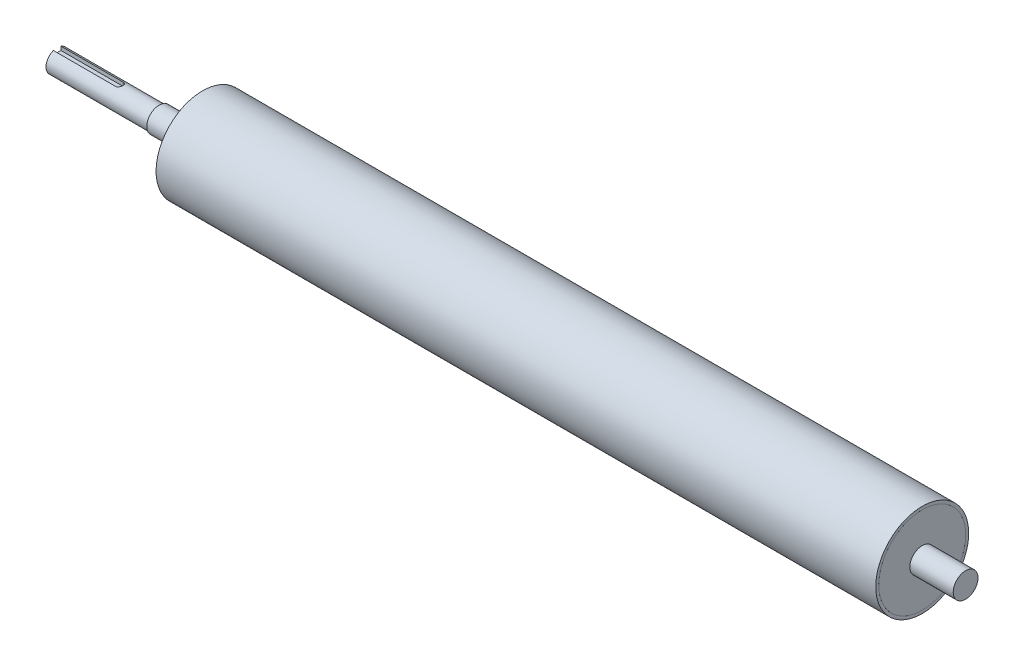
ISO-10303-21;
HEADER;
FILE_DESCRIPTION(('STEP AP214'),'2;1');
FILE_NAME('part.step','',(''),(''),'','','');
FILE_SCHEMA(('AUTOMOTIVE_DESIGN { 1 0 10303 214 1 1 1 1 }'));
ENDSEC;
DATA;
#1=APPLICATION_CONTEXT('core data for automotive mechanical design processes');
#2=APPLICATION_PROTOCOL_DEFINITION('international standard','automotive_design',2000,#1);
#3=PRODUCT_CONTEXT('',#1,'mechanical');
#4=PRODUCT('Part','Part','',(#3));
#5=PRODUCT_RELATED_PRODUCT_CATEGORY('part','',(#4));
#6=PRODUCT_DEFINITION_FORMATION('','',#4);
#7=PRODUCT_DEFINITION_CONTEXT('part definition',#1,'design');
#8=PRODUCT_DEFINITION('design','',#6,#7);
#9=PRODUCT_DEFINITION_SHAPE('','',#8);
#10=(LENGTH_UNIT() NAMED_UNIT(*) SI_UNIT(.MILLI.,.METRE.));
#11=(NAMED_UNIT(*) PLANE_ANGLE_UNIT() SI_UNIT($,.RADIAN.));
#12=(NAMED_UNIT(*) SI_UNIT($,.STERADIAN.) SOLID_ANGLE_UNIT());
#13=UNCERTAINTY_MEASURE_WITH_UNIT(LENGTH_MEASURE(1.E-05),#10,'distance_accuracy_value','');
#14=(GEOMETRIC_REPRESENTATION_CONTEXT(3) GLOBAL_UNCERTAINTY_ASSIGNED_CONTEXT((#13)) GLOBAL_UNIT_ASSIGNED_CONTEXT((#10,
#11,#12)) REPRESENTATION_CONTEXT('',''));
#15=CARTESIAN_POINT('',(0.,0.,0.));
#16=DIRECTION('',(0.,0.,1.));
#17=DIRECTION('',(1.,0.,0.));
#18=AXIS2_PLACEMENT_3D('',#15,#16,#17);
#19=CARTESIAN_POINT('',(-325.3,9.99999999999996,0.));
#20=DIRECTION('',(1.,0.,0.));
#21=DIRECTION('',(0.,1.,0.));
#22=AXIS2_PLACEMENT_3D('',#19,#20,#21);
#23=PLANE('',#22);
#24=CARTESIAN_POINT('',(-325.3,0.,0.));
#25=DIRECTION('',(-1.,0.,0.));
#26=DIRECTION('',(0.,-1.,0.));
#27=AXIS2_PLACEMENT_3D('',#24,#25,#26);
#28=CIRCLE('',#27,9.);
#29=CARTESIAN_POINT('',(-325.3,-9.00000000000006,0.));
#30=VERTEX_POINT('',#29);
#31=EDGE_CURVE('E110',#30,#30,#28,.T.);
#32=ORIENTED_EDGE('',*,*,#31,.F.);
#33=EDGE_LOOP('',(#32));
#34=FACE_BOUND('',#33,.T.);
#35=CARTESIAN_POINT('',(-325.3,0.,0.));
#36=DIRECTION('',(-1.,0.,0.));
#37=DIRECTION('',(0.,-1.,0.));
#38=AXIS2_PLACEMENT_3D('',#35,#36,#37);
#39=CIRCLE('',#38,10.);
#40=CARTESIAN_POINT('',(-325.3,-10.0000000000001,0.));
#41=VERTEX_POINT('',#40);
#42=EDGE_CURVE('E118',#41,#41,#39,.T.);
#43=ORIENTED_EDGE('',*,*,#42,.T.);
#44=EDGE_LOOP('',(#43));
#45=FACE_BOUND('',#44,.T.);
#46=ADVANCED_FACE('F45',(#34,#45),#23,.F.);
#47=CARTESIAN_POINT('',(-407.6,0.,0.));
#48=DIRECTION('',(-1.,0.,0.));
#49=DIRECTION('',(0.,-1.,0.));
#50=AXIS2_PLACEMENT_3D('',#47,#48,#49);
#51=CYLINDRICAL_SURFACE('',#50,10.0000000000001);
#52=ORIENTED_EDGE('',*,*,#42,.F.);
#53=EDGE_LOOP('',(#52));
#54=FACE_BOUND('',#53,.T.);
#55=CARTESIAN_POINT('',(325.3,0.,0.));
#56=DIRECTION('',(-1.,0.,0.));
#57=DIRECTION('',(0.,-1.,0.));
#58=AXIS2_PLACEMENT_3D('',#55,#56,#57);
#59=CIRCLE('',#58,10.0000000000001);
#60=CARTESIAN_POINT('',(325.3,-10.,0.));
#61=VERTEX_POINT('',#60);
#62=EDGE_CURVE('E115',#61,#61,#59,.T.);
#63=ORIENTED_EDGE('',*,*,#62,.T.);
#64=EDGE_LOOP('',(#63));
#65=FACE_BOUND('',#64,.T.);
#66=ADVANCED_FACE('F145',(#54,#65),#51,.T.);
#67=CARTESIAN_POINT('',(325.3,10.0000000000002,0.));
#68=DIRECTION('',(-1.,0.,0.));
#69=DIRECTION('',(0.,-1.,0.));
#70=AXIS2_PLACEMENT_3D('',#67,#68,#69);
#71=PLANE('',#70);
#72=ORIENTED_EDGE('',*,*,#62,.F.);
#73=EDGE_LOOP('',(#72));
#74=FACE_BOUND('',#73,.T.);
#75=ADVANCED_FACE('F150',(#74),#71,.F.);
#76=CARTESIAN_POINT('',(-407.6,8.99999999999991,0.));
#77=DIRECTION('',(1.,0.,0.));
#78=DIRECTION('',(0.,1.,0.));
#79=AXIS2_PLACEMENT_3D('',#76,#77,#78);
#80=PLANE('',#79);
#81=DIRECTION('',(0.,0.,1.));
#82=VECTOR('',#81,1.);
#83=CARTESIAN_POINT('',(-407.6,5.49999999999991,3.));
#84=LINE('',#83,#82);
#85=CARTESIAN_POINT('',(-407.6,5.49999999999991,-3.));
#86=VERTEX_POINT('',#85);
#87=CARTESIAN_POINT('',(-407.6,5.49999999999991,3.));
#88=VERTEX_POINT('',#87);
#89=EDGE_CURVE('E91',#86,#88,#84,.T.);
#90=ORIENTED_EDGE('',*,*,#89,.F.);
#91=DIRECTION('',(0.,1.,0.));
#92=VECTOR('',#91,1.);
#93=CARTESIAN_POINT('',(-407.6,5.49999999999991,-3.));
#94=LINE('',#93,#92);
#95=CARTESIAN_POINT('',(-407.6,8.48528137423848,-3.));
#96=VERTEX_POINT('',#95);
#97=EDGE_CURVE('E113',#86,#96,#94,.T.);
#98=ORIENTED_EDGE('',*,*,#97,.T.);
#99=CARTESIAN_POINT('',(-407.6,0.,0.));
#100=DIRECTION('',(-1.,0.,0.));
#101=DIRECTION('',(0.,-1.,0.));
#102=AXIS2_PLACEMENT_3D('',#99,#100,#101);
#103=CIRCLE('',#102,9.);
#104=CARTESIAN_POINT('',(-407.6,8.48528137423848,3.));
#105=VERTEX_POINT('',#104);
#106=EDGE_CURVE('E103',#96,#105,#103,.T.);
#107=ORIENTED_EDGE('',*,*,#106,.T.);
#108=DIRECTION('',(0.,1.,0.));
#109=VECTOR('',#108,1.);
#110=CARTESIAN_POINT('',(-407.6,5.49999999999991,3.));
#111=LINE('',#110,#109);
#112=EDGE_CURVE('E59',#88,#105,#111,.T.);
#113=ORIENTED_EDGE('',*,*,#112,.F.);
#114=EDGE_LOOP('',(#90,#98,#107,#113));
#115=FACE_BOUND('',#114,.T.);
#116=ADVANCED_FACE('F101',(#115),#80,.F.);
#117=CARTESIAN_POINT('',(-407.6,0.,0.));
#118=DIRECTION('',(-1.,0.,0.));
#119=DIRECTION('',(0.,-1.,0.));
#120=AXIS2_PLACEMENT_3D('',#117,#118,#119);
#121=CYLINDRICAL_SURFACE('',#120,9.);
#122=ORIENTED_EDGE('',*,*,#106,.F.);
#123=DIRECTION('',(-1.,0.,0.));
#124=VECTOR('',#123,1.);
#125=CARTESIAN_POINT('',(-407.6,8.48528137423848,-3.));
#126=LINE('',#125,#124);
#127=CARTESIAN_POINT('',(-357.6,8.48528137423849,-3.));
#128=VERTEX_POINT('',#127);
#129=EDGE_CURVE('E12',#96,#128,#126,.F.);
#130=ORIENTED_EDGE('',*,*,#129,.T.);
#131=CARTESIAN_POINT('',(-357.6,8.48528137423849,-3.));
#132=CARTESIAN_POINT('',(-357.518151506616,8.48526831927781,-3.00001078932487));
#133=CARTESIAN_POINT('',(-357.43631031039,8.48646532685475,-2.99665064665902));
#134=CARTESIAN_POINT('',(-357.273262753981,8.49118228945201,-2.98327254936565));
#135=CARTESIAN_POINT('',(-357.192056228414,8.49470161740763,-2.97325639196642));
#136=CARTESIAN_POINT('',(-357.031091413975,8.50395246303,-2.94668951307354));
#137=CARTESIAN_POINT('',(-356.951329556939,8.50967741820134,-2.93015817315762));
#138=CARTESIAN_POINT('',(-356.793590077701,8.52315143887195,-2.89073017236145));
#139=CARTESIAN_POINT('',(-356.715612520092,8.53090057752389,-2.8678332814324));
#140=CARTESIAN_POINT('',(-356.485246104343,8.55683928952686,-2.7898986156743));
#141=CARTESIAN_POINT('',(-356.336185011037,8.57773492660852,-2.72557700172275));
#142=CARTESIAN_POINT('',(-356.050947826243,8.62436440905019,-2.57421340927528));
#143=CARTESIAN_POINT('',(-355.914779717059,8.65010122261294,-2.48715747922329));
#144=CARTESIAN_POINT('',(-355.65384851584,8.70463418867357,-2.28915595016085));
#145=CARTESIAN_POINT('',(-355.529657828698,8.73350627313635,-2.17747541556634));
#146=CARTESIAN_POINT('',(-355.3013794761,8.79041552071275,-1.93496485428979));
#147=CARTESIAN_POINT('',(-355.197295390344,8.81845253440355,-1.80413142497752));
#148=CARTESIAN_POINT('',(-355.00956213096,8.87141647315461,-1.52281106991367));
#149=CARTESIAN_POINT('',(-354.926517230993,8.89624312238913,-1.37190030336068));
#150=CARTESIAN_POINT('',(-354.787223060795,8.93908826260472,-1.05728771462314));
#151=CARTESIAN_POINT('',(-354.730965605029,8.95710883299474,-0.893589817668303));
#152=CARTESIAN_POINT('',(-354.648792869513,8.98377213313365,-0.56408804522907));
#153=CARTESIAN_POINT('',(-354.621890198608,8.99271926928144,-0.398555505085322));
#154=CARTESIAN_POINT('',(-354.596051088158,9.00130825249003,-0.0650969066624023));
#155=CARTESIAN_POINT('',(-354.597107984901,9.00095231678781,0.10282857176299));
#156=CARTESIAN_POINT('',(-354.626532865931,8.99118115872276,0.429311537733992));
#157=CARTESIAN_POINT('',(-354.653827964006,8.98212182877029,0.587978116884612));
#158=CARTESIAN_POINT('',(-354.733179545892,8.95640881599222,0.898332184121453));
#159=CARTESIAN_POINT('',(-354.785237402705,8.93975471206717,1.05001928471038));
#160=CARTESIAN_POINT('',(-354.913264295135,8.90027004455723,1.34445790368095));
#161=CARTESIAN_POINT('',(-354.989538834144,8.87736112172102,1.48706564697704));
#162=CARTESIAN_POINT('',(-355.163579155205,8.82775164383318,1.75777363724201));
#163=CARTESIAN_POINT('',(-355.261350783324,8.80105005807901,1.8858699234783));
#164=CARTESIAN_POINT('',(-355.481015882458,8.74518810577387,2.13029252762404));
#165=CARTESIAN_POINT('',(-355.603827051324,8.71597116015311,2.24578277403273));
#166=CARTESIAN_POINT('',(-355.867314045293,8.65942491449427,2.45481413464108));
#167=CARTESIAN_POINT('',(-356.007995619292,8.63209622629487,2.54834815783838));
#168=CARTESIAN_POINT('',(-356.306080078237,8.58210018141269,2.71201733554395));
#169=CARTESIAN_POINT('',(-356.463699151119,8.55950759277128,2.78178668333576));
#170=CARTESIAN_POINT('',(-356.707684134555,8.53168491329452,2.86551808116444));
#171=CARTESIAN_POINT('',(-356.79025675707,8.52342263559062,2.88993900052899));
#172=CARTESIAN_POINT('',(-356.95737039621,8.50917513666648,2.93162549079288));
#173=CARTESIAN_POINT('',(-357.041910495336,8.50318887578229,2.94889432902106));
#174=CARTESIAN_POINT('',(-357.205233277751,8.49410161473159,2.9749655599127));
#175=CARTESIAN_POINT('',(-357.283912860636,8.49080270505205,2.98435073218187));
#176=CARTESIAN_POINT('',(-357.441725529505,8.48638843638529,2.99686829404163));
#177=CARTESIAN_POINT('',(-357.520857897642,8.48527025982555,3.00000875209308));
#178=CARTESIAN_POINT('',(-357.6,8.4852813742385,2.99999999999998));
#179=B_SPLINE_CURVE_WITH_KNOTS('',3,(#131,#132,#133,#134,#135,#136,#137,#138,#139,#140,#141,
#142,#143,#144,#145,#146,#147,#148,#149,#150,#151,#152,#153,#154,#155,#156,#157,#158,#159,#160,
#161,#162,#163,#164,#165,#166,#167,#168,#169,#170,#171,#172,#173,#174,#175,#176,#177,#178),
.UNSPECIFIED.,.F.,.F.,(4,2,2,2,2,2,2,2,2,2,2,2,2,2,2,2,2,2,2,2,2,2,2,4),(0.,0.245455454206266,
0.490844658508351,0.735509315314879,0.980182815366482,1.46881220307905,1.95774215958629,
2.46393436906066,2.97021661609275,3.48971320817338,4.00905095381417,4.51032334200244,
5.01147626109962,5.49297177415239,5.97449398742777,6.46234978495939,6.95033841784343,
7.46126084192186,7.97234804765762,8.49098011802154,8.75020549988893,9.00931232726957,
9.24695816264688,9.48429674853606),.UNSPECIFIED.);
#180=CARTESIAN_POINT('',(-357.6,8.48528137423848,2.99999999999998));
#181=VERTEX_POINT('',#180);
#182=EDGE_CURVE('E121',#128,#181,#179,.T.);
#183=ORIENTED_EDGE('',*,*,#182,.T.);
#184=DIRECTION('',(-1.,0.,0.));
#185=VECTOR('',#184,1.);
#186=CARTESIAN_POINT('',(-407.6,8.48528137423848,3.));
#187=LINE('',#186,#185);
#188=EDGE_CURVE('E52',#181,#105,#187,.T.);
#189=ORIENTED_EDGE('',*,*,#188,.T.);
#190=EDGE_LOOP('',(#122,#130,#183,#189));
#191=FACE_BOUND('',#190,.T.);
#192=ORIENTED_EDGE('',*,*,#31,.T.);
#193=EDGE_LOOP('',(#192));
#194=FACE_BOUND('',#193,.T.);
#195=ADVANCED_FACE('F129',(#191,#194),#121,.T.);
#196=CARTESIAN_POINT('',(-407.6,5.49999999999991,-3.));
#197=DIRECTION('',(0.,0.,-1.));
#198=DIRECTION('',(-1.,0.,0.));
#199=AXIS2_PLACEMENT_3D('',#196,#197,#198);
#200=PLANE('',#199);
#201=ORIENTED_EDGE('',*,*,#97,.F.);
#202=DIRECTION('',(-1.,0.,0.));
#203=VECTOR('',#202,1.);
#204=CARTESIAN_POINT('',(-407.6,5.49999999999991,-3.));
#205=LINE('',#204,#203);
#206=CARTESIAN_POINT('',(-357.6,5.49999999999992,-3.));
#207=VERTEX_POINT('',#206);
#208=EDGE_CURVE('E97',#207,#86,#205,.T.);
#209=ORIENTED_EDGE('',*,*,#208,.F.);
#210=DIRECTION('',(0.,1.,0.));
#211=VECTOR('',#210,1.);
#212=CARTESIAN_POINT('',(-357.6,5.49999999999992,-3.));
#213=LINE('',#212,#211);
#214=EDGE_CURVE('E105',#207,#128,#213,.T.);
#215=ORIENTED_EDGE('',*,*,#214,.T.);
#216=ORIENTED_EDGE('',*,*,#129,.F.);
#217=EDGE_LOOP('',(#201,#209,#215,#216));
#218=FACE_BOUND('',#217,.T.);
#219=ADVANCED_FACE('F137',(#218),#200,.F.);
#220=CARTESIAN_POINT('',(-357.6,5.49999999999992,0.));
#221=DIRECTION('',(0.,1.,0.));
#222=DIRECTION('',(-1.,0.,0.));
#223=AXIS2_PLACEMENT_3D('',#220,#221,#222);
#224=CYLINDRICAL_SURFACE('',#223,2.99999999999999);
#225=ORIENTED_EDGE('',*,*,#214,.F.);
#226=CARTESIAN_POINT('',(-357.6,5.49999999999992,0.));
#227=DIRECTION('',(0.,1.,0.));
#228=DIRECTION('',(1.,0.,0.));
#229=AXIS2_PLACEMENT_3D('',#226,#227,#228);
#230=CIRCLE('',#229,2.99999999999999);
#231=CARTESIAN_POINT('',(-357.6,5.49999999999992,2.99999999999998));
#232=VERTEX_POINT('',#231);
#233=EDGE_CURVE('E90',#232,#207,#230,.T.);
#234=ORIENTED_EDGE('',*,*,#233,.F.);
#235=DIRECTION('',(0.,1.,0.));
#236=VECTOR('',#235,1.);
#237=CARTESIAN_POINT('',(-357.6,5.49999999999992,2.99999999999998));
#238=LINE('',#237,#236);
#239=EDGE_CURVE('E86',#232,#181,#238,.T.);
#240=ORIENTED_EDGE('',*,*,#239,.T.);
#241=ORIENTED_EDGE('',*,*,#182,.F.);
#242=EDGE_LOOP('',(#225,#234,#240,#241));
#243=FACE_BOUND('',#242,.T.);
#244=ADVANCED_FACE('F133',(#243),#224,.F.);
#245=CARTESIAN_POINT('',(-357.6,5.49999999999992,2.99999999999998));
#246=DIRECTION('',(0.,0.,1.));
#247=DIRECTION('',(1.,0.,0.));
#248=AXIS2_PLACEMENT_3D('',#245,#246,#247);
#249=PLANE('',#248);
#250=ORIENTED_EDGE('',*,*,#239,.F.);
#251=DIRECTION('',(1.,0.,0.));
#252=VECTOR('',#251,1.);
#253=CARTESIAN_POINT('',(-357.6,5.49999999999992,2.99999999999998));
#254=LINE('',#253,#252);
#255=EDGE_CURVE('E82',#88,#232,#254,.T.);
#256=ORIENTED_EDGE('',*,*,#255,.F.);
#257=ORIENTED_EDGE('',*,*,#112,.T.);
#258=ORIENTED_EDGE('',*,*,#188,.F.);
#259=EDGE_LOOP('',(#250,#256,#257,#258));
#260=FACE_BOUND('',#259,.T.);
#261=ADVANCED_FACE('F84',(#260),#249,.F.);
#262=CARTESIAN_POINT('',(-357.6,5.49999999999992,0.));
#263=DIRECTION('',(0.,-1.,0.));
#264=DIRECTION('',(1.,0.,0.));
#265=AXIS2_PLACEMENT_3D('',#262,#263,#264);
#266=PLANE('',#265);
#267=ORIENTED_EDGE('',*,*,#89,.T.);
#268=ORIENTED_EDGE('',*,*,#255,.T.);
#269=ORIENTED_EDGE('',*,*,#233,.T.);
#270=ORIENTED_EDGE('',*,*,#208,.T.);
#271=EDGE_LOOP('',(#267,#268,#269,#270));
#272=FACE_BOUND('',#271,.T.);
#273=ADVANCED_FACE('F95',(#272),#266,.F.);
#274=CLOSED_SHELL('',(#46,#66,#75,#116,#195,#219,#244,#261,#273));
#275=MANIFOLD_SOLID_BREP('B2',#274);
#276=CARTESIAN_POINT('',(280.3,0.,0.));
#277=DIRECTION('',(1.,0.,0.));
#278=DIRECTION('',(0.,1.,0.));
#279=AXIS2_PLACEMENT_3D('',#276,#277,#278);
#280=CYLINDRICAL_SURFACE('',#279,35.1);
#281=CARTESIAN_POINT('',(280.3,0.,0.));
#282=DIRECTION('',(1.,0.,0.));
#283=DIRECTION('',(0.,1.,0.));
#284=AXIS2_PLACEMENT_3D('',#281,#282,#283);
#285=CIRCLE('',#284,35.1);
#286=CARTESIAN_POINT('',(280.3,35.1000000000001,0.));
#287=VERTEX_POINT('',#286);
#288=EDGE_CURVE('E44',#287,#287,#285,.T.);
#289=ORIENTED_EDGE('',*,*,#288,.T.);
#290=EDGE_LOOP('',(#289));
#291=FACE_BOUND('',#290,.T.);
#292=CARTESIAN_POINT('',(290.3,0.,0.));
#293=DIRECTION('',(1.,0.,0.));
#294=DIRECTION('',(0.,1.,0.));
#295=AXIS2_PLACEMENT_3D('',#292,#293,#294);
#296=CIRCLE('',#295,35.1);
#297=CARTESIAN_POINT('',(290.3,35.1000000000001,0.));
#298=VERTEX_POINT('',#297);
#299=EDGE_CURVE('E230',#298,#298,#296,.T.);
#300=ORIENTED_EDGE('',*,*,#299,.F.);
#301=EDGE_LOOP('',(#300));
#302=FACE_BOUND('',#301,.T.);
#303=ADVANCED_FACE('F227',(#291,#302),#280,.T.);
#304=CARTESIAN_POINT('',(280.3,0.,0.));
#305=DIRECTION('',(1.,0.,0.));
#306=DIRECTION('',(0.,1.,0.));
#307=AXIS2_PLACEMENT_3D('',#304,#305,#306);
#308=PLANE('',#307);
#309=CARTESIAN_POINT('',(280.3,0.,0.));
#310=DIRECTION('',(1.,0.,0.));
#311=DIRECTION('',(0.,1.,0.));
#312=AXIS2_PLACEMENT_3D('',#309,#310,#311);
#313=CIRCLE('',#312,10.0005);
#314=CARTESIAN_POINT('',(280.3,10.0005000000001,0.));
#315=VERTEX_POINT('',#314);
#316=EDGE_CURVE('E237',#315,#315,#313,.T.);
#317=ORIENTED_EDGE('',*,*,#316,.T.);
#318=EDGE_LOOP('',(#317));
#319=FACE_BOUND('',#318,.T.);
#320=ORIENTED_EDGE('',*,*,#288,.F.);
#321=EDGE_LOOP('',(#320));
#322=FACE_BOUND('',#321,.T.);
#323=ADVANCED_FACE('F245',(#319,#322),#308,.F.);
#324=CARTESIAN_POINT('',(290.3,0.,0.));
#325=DIRECTION('',(1.,0.,0.));
#326=DIRECTION('',(0.,1.,0.));
#327=AXIS2_PLACEMENT_3D('',#324,#325,#326);
#328=PLANE('',#327);
#329=CARTESIAN_POINT('',(290.3,0.,0.));
#330=DIRECTION('',(1.,0.,0.));
#331=DIRECTION('',(0.,1.,0.));
#332=AXIS2_PLACEMENT_3D('',#329,#330,#331);
#333=CIRCLE('',#332,10.0005);
#334=CARTESIAN_POINT('',(290.3,10.0005000000001,0.));
#335=VERTEX_POINT('',#334);
#336=EDGE_CURVE('E239',#335,#335,#333,.T.);
#337=ORIENTED_EDGE('',*,*,#336,.F.);
#338=EDGE_LOOP('',(#337));
#339=FACE_BOUND('',#338,.T.);
#340=ORIENTED_EDGE('',*,*,#299,.T.);
#341=EDGE_LOOP('',(#340));
#342=FACE_BOUND('',#341,.T.);
#343=ADVANCED_FACE('F251',(#339,#342),#328,.T.);
#344=CARTESIAN_POINT('',(280.3,0.,0.));
#345=DIRECTION('',(1.,0.,0.));
#346=DIRECTION('',(0.,1.,0.));
#347=AXIS2_PLACEMENT_3D('',#344,#345,#346);
#348=CYLINDRICAL_SURFACE('',#347,10.0005);
#349=ORIENTED_EDGE('',*,*,#316,.F.);
#350=EDGE_LOOP('',(#349));
#351=FACE_BOUND('',#350,.T.);
#352=ORIENTED_EDGE('',*,*,#336,.T.);
#353=EDGE_LOOP('',(#352));
#354=FACE_BOUND('',#353,.T.);
#355=ADVANCED_FACE('F248',(#351,#354),#348,.F.);
#356=CLOSED_SHELL('',(#303,#323,#343,#355));
#357=MANIFOLD_SOLID_BREP('B6',#356);
#358=CARTESIAN_POINT('',(-280.3,0.,0.));
#359=DIRECTION('',(-1.,0.,0.));
#360=DIRECTION('',(0.,-1.,0.));
#361=AXIS2_PLACEMENT_3D('',#358,#359,#360);
#362=CYLINDRICAL_SURFACE('',#361,35.1);
#363=CARTESIAN_POINT('',(-280.3,0.,0.));
#364=DIRECTION('',(-1.,0.,0.));
#365=DIRECTION('',(0.,-1.,0.));
#366=AXIS2_PLACEMENT_3D('',#363,#364,#365);
#367=CIRCLE('',#366,35.1);
#368=CARTESIAN_POINT('',(-280.3,-35.1,0.));
#369=VERTEX_POINT('',#368);
#370=EDGE_CURVE('E226',#369,#369,#367,.T.);
#371=ORIENTED_EDGE('',*,*,#370,.T.);
#372=EDGE_LOOP('',(#371));
#373=FACE_BOUND('',#372,.T.);
#374=CARTESIAN_POINT('',(-290.3,0.,0.));
#375=DIRECTION('',(-1.,0.,0.));
#376=DIRECTION('',(0.,-1.,0.));
#377=AXIS2_PLACEMENT_3D('',#374,#375,#376);
#378=CIRCLE('',#377,35.1);
#379=CARTESIAN_POINT('',(-290.3,-35.1,0.));
#380=VERTEX_POINT('',#379);
#381=EDGE_CURVE('E298',#380,#380,#378,.T.);
#382=ORIENTED_EDGE('',*,*,#381,.F.);
#383=EDGE_LOOP('',(#382));
#384=FACE_BOUND('',#383,.T.);
#385=ADVANCED_FACE('F295',(#373,#384),#362,.T.);
#386=CARTESIAN_POINT('',(-280.3,0.,0.));
#387=DIRECTION('',(-1.,0.,0.));
#388=DIRECTION('',(0.,-1.,0.));
#389=AXIS2_PLACEMENT_3D('',#386,#387,#388);
#390=PLANE('',#389);
#391=CARTESIAN_POINT('',(-280.3,0.,0.));
#392=DIRECTION('',(-1.,0.,0.));
#393=DIRECTION('',(0.,-1.,0.));
#394=AXIS2_PLACEMENT_3D('',#391,#392,#393);
#395=CIRCLE('',#394,10.0005);
#396=CARTESIAN_POINT('',(-280.3,-10.0005,0.));
#397=VERTEX_POINT('',#396);
#398=EDGE_CURVE('E305',#397,#397,#395,.T.);
#399=ORIENTED_EDGE('',*,*,#398,.T.);
#400=EDGE_LOOP('',(#399));
#401=FACE_BOUND('',#400,.T.);
#402=ORIENTED_EDGE('',*,*,#370,.F.);
#403=EDGE_LOOP('',(#402));
#404=FACE_BOUND('',#403,.T.);
#405=ADVANCED_FACE('F313',(#401,#404),#390,.F.);
#406=CARTESIAN_POINT('',(-290.3,0.,0.));
#407=DIRECTION('',(-1.,0.,0.));
#408=DIRECTION('',(0.,-1.,0.));
#409=AXIS2_PLACEMENT_3D('',#406,#407,#408);
#410=PLANE('',#409);
#411=CARTESIAN_POINT('',(-290.3,0.,0.));
#412=DIRECTION('',(-1.,0.,0.));
#413=DIRECTION('',(0.,-1.,0.));
#414=AXIS2_PLACEMENT_3D('',#411,#412,#413);
#415=CIRCLE('',#414,10.0005);
#416=CARTESIAN_POINT('',(-290.3,-10.0005,0.));
#417=VERTEX_POINT('',#416);
#418=EDGE_CURVE('E307',#417,#417,#415,.T.);
#419=ORIENTED_EDGE('',*,*,#418,.F.);
#420=EDGE_LOOP('',(#419));
#421=FACE_BOUND('',#420,.T.);
#422=ORIENTED_EDGE('',*,*,#381,.T.);
#423=EDGE_LOOP('',(#422));
#424=FACE_BOUND('',#423,.T.);
#425=ADVANCED_FACE('F319',(#421,#424),#410,.T.);
#426=CARTESIAN_POINT('',(-280.3,0.,0.));
#427=DIRECTION('',(-1.,0.,0.));
#428=DIRECTION('',(0.,-1.,0.));
#429=AXIS2_PLACEMENT_3D('',#426,#427,#428);
#430=CYLINDRICAL_SURFACE('',#429,10.0005);
#431=ORIENTED_EDGE('',*,*,#398,.F.);
#432=EDGE_LOOP('',(#431));
#433=FACE_BOUND('',#432,.T.);
#434=ORIENTED_EDGE('',*,*,#418,.T.);
#435=EDGE_LOOP('',(#434));
#436=FACE_BOUND('',#435,.T.);
#437=ADVANCED_FACE('F316',(#433,#436),#430,.F.);
#438=CLOSED_SHELL('',(#385,#405,#425,#437));
#439=MANIFOLD_SOLID_BREP('B39',#438);
#440=CARTESIAN_POINT('',(-290.3,35.1004999999999,0.));
#441=DIRECTION('',(1.,0.,0.));
#442=DIRECTION('',(0.,1.,0.));
#443=AXIS2_PLACEMENT_3D('',#440,#441,#442);
#444=PLANE('',#443);
#445=CARTESIAN_POINT('',(-290.3,0.,0.));
#446=DIRECTION('',(-1.,0.,0.));
#447=DIRECTION('',(0.,-1.,0.));
#448=AXIS2_PLACEMENT_3D('',#445,#446,#447);
#449=CIRCLE('',#448,35.1004999999999);
#450=CARTESIAN_POINT('',(-290.3,-35.1004999999999,0.));
#451=VERTEX_POINT('',#450);
#452=EDGE_CURVE('E370',#451,#451,#449,.T.);
#453=ORIENTED_EDGE('',*,*,#452,.F.);
#454=EDGE_LOOP('',(#453));
#455=FACE_BOUND('',#454,.T.);
#456=CARTESIAN_POINT('',(-290.3,0.,0.));
#457=DIRECTION('',(-1.,0.,0.));
#458=DIRECTION('',(0.,-1.,0.));
#459=AXIS2_PLACEMENT_3D('',#456,#457,#458);
#460=CIRCLE('',#459,37.5);
#461=CARTESIAN_POINT('',(-290.3,-37.5,0.));
#462=VERTEX_POINT('',#461);
#463=EDGE_CURVE('E294',#462,#462,#460,.T.);
#464=ORIENTED_EDGE('',*,*,#463,.T.);
#465=EDGE_LOOP('',(#464));
#466=FACE_BOUND('',#465,.T.);
#467=ADVANCED_FACE('F356',(#455,#466),#444,.F.);
#468=CARTESIAN_POINT('',(-290.3,0.,0.));
#469=DIRECTION('',(-1.,0.,0.));
#470=DIRECTION('',(0.,-1.,0.));
#471=AXIS2_PLACEMENT_3D('',#468,#469,#470);
#472=CYLINDRICAL_SURFACE('',#471,37.5);
#473=ORIENTED_EDGE('',*,*,#463,.F.);
#474=EDGE_LOOP('',(#473));
#475=FACE_BOUND('',#474,.T.);
#476=CARTESIAN_POINT('',(290.3,1.06654489737743E-13,0.));
#477=DIRECTION('',(-1.,0.,0.));
#478=DIRECTION('',(0.,-1.,0.));
#479=AXIS2_PLACEMENT_3D('',#476,#477,#478);
#480=CIRCLE('',#479,37.5);
#481=CARTESIAN_POINT('',(290.3,-37.4999999999999,0.));
#482=VERTEX_POINT('',#481);
#483=EDGE_CURVE('E362',#482,#482,#480,.T.);
#484=ORIENTED_EDGE('',*,*,#483,.T.);
#485=EDGE_LOOP('',(#484));
#486=FACE_BOUND('',#485,.T.);
#487=ADVANCED_FACE('F379',(#475,#486),#472,.T.);
#488=CARTESIAN_POINT('',(290.3,37.5000000000001,0.));
#489=DIRECTION('',(-1.,0.,0.));
#490=DIRECTION('',(0.,-1.,0.));
#491=AXIS2_PLACEMENT_3D('',#488,#489,#490);
#492=PLANE('',#491);
#493=ORIENTED_EDGE('',*,*,#483,.F.);
#494=EDGE_LOOP('',(#493));
#495=FACE_BOUND('',#494,.T.);
#496=CARTESIAN_POINT('',(290.3,1.06654489737743E-13,0.));
#497=DIRECTION('',(-1.,0.,0.));
#498=DIRECTION('',(0.,-1.,0.));
#499=AXIS2_PLACEMENT_3D('',#496,#497,#498);
#500=CIRCLE('',#499,35.1004999999999);
#501=CARTESIAN_POINT('',(290.3,-35.1004999999998,0.));
#502=VERTEX_POINT('',#501);
#503=EDGE_CURVE('E366',#502,#502,#500,.T.);
#504=ORIENTED_EDGE('',*,*,#503,.T.);
#505=EDGE_LOOP('',(#504));
#506=FACE_BOUND('',#505,.T.);
#507=ADVANCED_FACE('F383',(#495,#506),#492,.F.);
#508=CARTESIAN_POINT('',(-290.3,0.,0.));
#509=DIRECTION('',(-1.,0.,0.));
#510=DIRECTION('',(0.,-1.,0.));
#511=AXIS2_PLACEMENT_3D('',#508,#509,#510);
#512=CYLINDRICAL_SURFACE('',#511,35.1004999999999);
#513=ORIENTED_EDGE('',*,*,#503,.F.);
#514=EDGE_LOOP('',(#513));
#515=FACE_BOUND('',#514,.T.);
#516=ORIENTED_EDGE('',*,*,#452,.T.);
#517=EDGE_LOOP('',(#516));
#518=FACE_BOUND('',#517,.T.);
#519=ADVANCED_FACE('F376',(#515,#518),#512,.F.);
#520=CLOSED_SHELL('',(#467,#487,#507,#519));
#521=MANIFOLD_SOLID_BREP('B221',#520);
#522=ADVANCED_BREP_SHAPE_REPRESENTATION('',(#18,#275,#357,#439,#521),#14);
#523=SHAPE_DEFINITION_REPRESENTATION(#9,#522);
ENDSEC;
END-ISO-10303-21;
